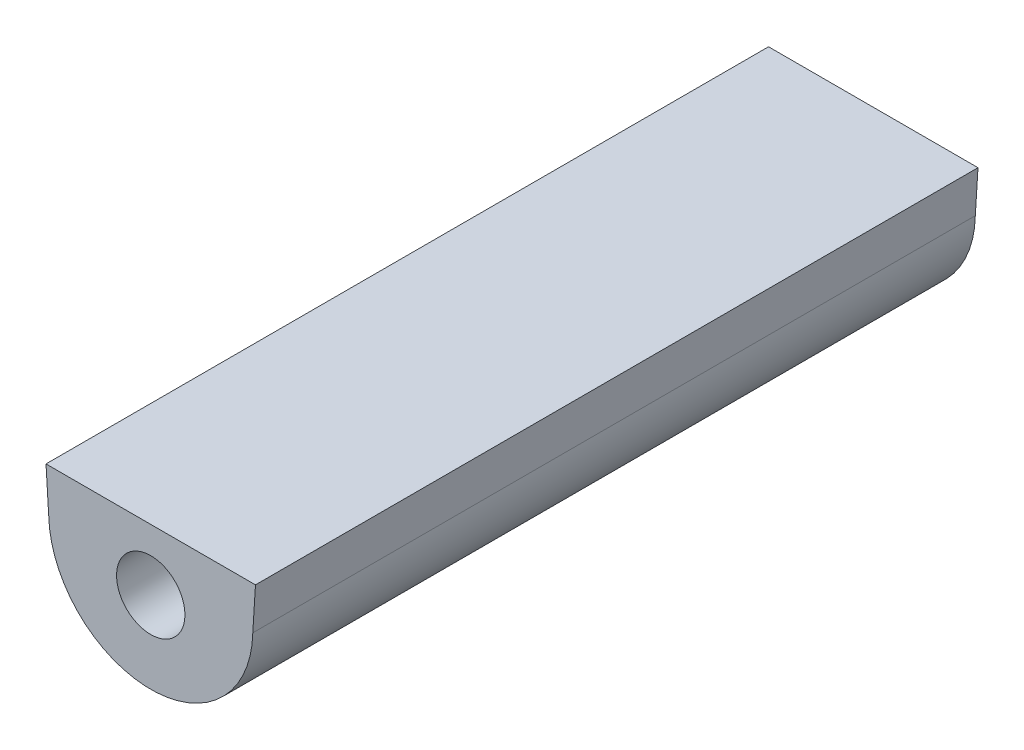
ISO-10303-21;
HEADER;
FILE_DESCRIPTION(('STEP AP214'),'2;1');
FILE_NAME('part.step','',(''),(''),'','','');
FILE_SCHEMA(('AUTOMOTIVE_DESIGN { 1 0 10303 214 1 1 1 1 }'));
ENDSEC;
DATA;
#1=APPLICATION_CONTEXT('core data for automotive mechanical design processes');
#2=APPLICATION_PROTOCOL_DEFINITION('international standard','automotive_design',2000,#1);
#3=PRODUCT_CONTEXT('',#1,'mechanical');
#4=PRODUCT('Part','Part','',(#3));
#5=PRODUCT_RELATED_PRODUCT_CATEGORY('part','',(#4));
#6=PRODUCT_DEFINITION_FORMATION('','',#4);
#7=PRODUCT_DEFINITION_CONTEXT('part definition',#1,'design');
#8=PRODUCT_DEFINITION('design','',#6,#7);
#9=PRODUCT_DEFINITION_SHAPE('','',#8);
#10=(LENGTH_UNIT() NAMED_UNIT(*) SI_UNIT(.MILLI.,.METRE.));
#11=(NAMED_UNIT(*) PLANE_ANGLE_UNIT() SI_UNIT($,.RADIAN.));
#12=(NAMED_UNIT(*) SI_UNIT($,.STERADIAN.) SOLID_ANGLE_UNIT());
#13=UNCERTAINTY_MEASURE_WITH_UNIT(LENGTH_MEASURE(1.E-05),#10,'distance_accuracy_value','');
#14=(GEOMETRIC_REPRESENTATION_CONTEXT(3) GLOBAL_UNCERTAINTY_ASSIGNED_CONTEXT((#13)) GLOBAL_UNIT_ASSIGNED_CONTEXT((#10,
#11,#12)) REPRESENTATION_CONTEXT('',''));
#15=CARTESIAN_POINT('',(0.,0.,0.));
#16=DIRECTION('',(0.,0.,1.));
#17=DIRECTION('',(1.,0.,0.));
#18=AXIS2_PLACEMENT_3D('',#15,#16,#17);
#19=CARTESIAN_POINT('',(0.312551774498435,-21.5437842902182,44.958));
#20=DIRECTION('',(0.,0.,1.));
#21=DIRECTION('',(1.,0.,0.));
#22=AXIS2_PLACEMENT_3D('',#19,#20,#21);
#23=PLANE('',#22);
#24=DIRECTION('',(1.,0.,0.));
#25=VECTOR('',#24,1.);
#26=CARTESIAN_POINT('',(-27.7506064541846,-19.0051466481699,44.958));
#27=LINE('',#26,#25);
#28=CARTESIAN_POINT('',(-6.20433457291966,-19.0051466481699,44.958));
#29=VERTEX_POINT('',#28);
#30=CARTESIAN_POINT('',(6.82943812191652,-19.0051466481699,44.958));
#31=VERTEX_POINT('',#30);
#32=EDGE_CURVE('E126',#29,#31,#27,.T.);
#33=ORIENTED_EDGE('',*,*,#32,.F.);
#34=DIRECTION('',(0.0623782861551805,-0.998052578482889,0.));
#35=VECTOR('',#34,1.);
#36=CARTESIAN_POINT('',(-9.15610687723631,28.2232102208965,44.958));
#37=LINE('',#36,#35);
#38=CARTESIAN_POINT('',(-6.03744822550156,-21.6753282068594,44.958));
#39=VERTEX_POINT('',#38);
#40=EDGE_CURVE('E63',#29,#39,#37,.T.);
#41=ORIENTED_EDGE('',*,*,#40,.T.);
#42=CARTESIAN_POINT('',(0.312551774498435,-21.5437842902182,44.958));
#43=DIRECTION('',(0.,0.,1.));
#44=DIRECTION('',(1.,0.,0.));
#45=AXIS2_PLACEMENT_3D('',#42,#43,#44);
#46=CIRCLE('',#45,6.35136235795166);
#47=CARTESIAN_POINT('',(6.66255177449844,-21.6753282068593,44.958));
#48=VERTEX_POINT('',#47);
#49=EDGE_CURVE('E84',#39,#48,#46,.T.);
#50=ORIENTED_EDGE('',*,*,#49,.T.);
#51=DIRECTION('',(0.0623782861551806,0.998052578482888,0.));
#52=VECTOR('',#51,1.);
#53=CARTESIAN_POINT('',(6.66255177449844,-21.6753282068593,44.958));
#54=LINE('',#53,#52);
#55=EDGE_CURVE('E113',#48,#31,#54,.T.);
#56=ORIENTED_EDGE('',*,*,#55,.T.);
#57=EDGE_LOOP('',(#33,#41,#50,#56));
#58=FACE_BOUND('',#57,.T.);
#59=CARTESIAN_POINT('',(0.312551774498428,-22.8151466481699,44.958));
#60=DIRECTION('',(0.,0.,1.));
#61=DIRECTION('',(1.,0.,0.));
#62=AXIS2_PLACEMENT_3D('',#59,#60,#61);
#63=CIRCLE('',#62,2.127);
#64=CARTESIAN_POINT('',(2.43955177449843,-22.8151466481699,44.958));
#65=VERTEX_POINT('',#64);
#66=EDGE_CURVE('E98',#65,#65,#63,.T.);
#67=ORIENTED_EDGE('',*,*,#66,.F.);
#68=EDGE_LOOP('',(#67));
#69=FACE_BOUND('',#68,.T.);
#70=ADVANCED_FACE('F39',(#58,#69),#23,.T.);
#71=CARTESIAN_POINT('',(0.312551774498435,-21.5437842902182,0.));
#72=DIRECTION('',(0.,0.,1.));
#73=DIRECTION('',(1.,0.,0.));
#74=AXIS2_PLACEMENT_3D('',#71,#72,#73);
#75=PLANE('',#74);
#76=DIRECTION('',(0.0623782861551805,-0.998052578482889,0.));
#77=VECTOR('',#76,1.);
#78=CARTESIAN_POINT('',(-9.15610687723631,28.2232102208965,0.));
#79=LINE('',#78,#77);
#80=CARTESIAN_POINT('',(-6.20433457291966,-19.0051466481699,0.));
#81=VERTEX_POINT('',#80);
#82=CARTESIAN_POINT('',(-6.03744822550156,-21.6753282068594,0.));
#83=VERTEX_POINT('',#82);
#84=EDGE_CURVE('E76',#81,#83,#79,.T.);
#85=ORIENTED_EDGE('',*,*,#84,.F.);
#86=DIRECTION('',(1.,0.,0.));
#87=VECTOR('',#86,1.);
#88=CARTESIAN_POINT('',(-27.7506064541846,-19.0051466481699,0.));
#89=LINE('',#88,#87);
#90=CARTESIAN_POINT('',(6.82943812191652,-19.0051466481699,0.));
#91=VERTEX_POINT('',#90);
#92=EDGE_CURVE('E55',#81,#91,#89,.T.);
#93=ORIENTED_EDGE('',*,*,#92,.T.);
#94=DIRECTION('',(0.0623782861551806,0.998052578482888,0.));
#95=VECTOR('',#94,1.);
#96=CARTESIAN_POINT('',(6.66255177449844,-21.6753282068593,0.));
#97=LINE('',#96,#95);
#98=CARTESIAN_POINT('',(6.66255177449844,-21.6753282068593,0.));
#99=VERTEX_POINT('',#98);
#100=EDGE_CURVE('E85',#99,#91,#97,.T.);
#101=ORIENTED_EDGE('',*,*,#100,.F.);
#102=CARTESIAN_POINT('',(0.312551774498435,-21.5437842902182,0.));
#103=DIRECTION('',(0.,0.,1.));
#104=DIRECTION('',(1.,0.,0.));
#105=AXIS2_PLACEMENT_3D('',#102,#103,#104);
#106=CIRCLE('',#105,6.35136235795166);
#107=EDGE_CURVE('E90',#83,#99,#106,.T.);
#108=ORIENTED_EDGE('',*,*,#107,.F.);
#109=EDGE_LOOP('',(#85,#93,#101,#108));
#110=FACE_BOUND('',#109,.T.);
#111=CARTESIAN_POINT('',(0.312551774498428,-22.8151466481699,0.));
#112=DIRECTION('',(0.,0.,1.));
#113=DIRECTION('',(1.,0.,0.));
#114=AXIS2_PLACEMENT_3D('',#111,#112,#113);
#115=CIRCLE('',#114,2.127);
#116=CARTESIAN_POINT('',(2.43955177449843,-22.8151466481699,0.));
#117=VERTEX_POINT('',#116);
#118=EDGE_CURVE('E104',#117,#117,#115,.T.);
#119=ORIENTED_EDGE('',*,*,#118,.T.);
#120=EDGE_LOOP('',(#119));
#121=FACE_BOUND('',#120,.T.);
#122=ADVANCED_FACE('F93',(#110,#121),#75,.F.);
#123=CARTESIAN_POINT('',(0.312551774498435,-21.5437842902182,44.958));
#124=DIRECTION('',(0.,0.,-1.));
#125=DIRECTION('',(-1.,0.,0.));
#126=AXIS2_PLACEMENT_3D('',#123,#124,#125);
#127=CYLINDRICAL_SURFACE('',#126,6.35136235795166);
#128=ORIENTED_EDGE('',*,*,#107,.T.);
#129=DIRECTION('',(0.,0.,-1.));
#130=VECTOR('',#129,1.);
#131=CARTESIAN_POINT('',(6.66255177449844,-21.6753282068593,44.958));
#132=LINE('',#131,#130);
#133=EDGE_CURVE('E48',#48,#99,#132,.T.);
#134=ORIENTED_EDGE('',*,*,#133,.F.);
#135=ORIENTED_EDGE('',*,*,#49,.F.);
#136=DIRECTION('',(0.,0.,-1.));
#137=VECTOR('',#136,1.);
#138=CARTESIAN_POINT('',(-6.03744822550156,-21.6753282068594,44.958));
#139=LINE('',#138,#137);
#140=EDGE_CURVE('E79',#39,#83,#139,.T.);
#141=ORIENTED_EDGE('',*,*,#140,.T.);
#142=EDGE_LOOP('',(#128,#134,#135,#141));
#143=FACE_BOUND('',#142,.T.);
#144=ADVANCED_FACE('F41',(#143),#127,.T.);
#145=CARTESIAN_POINT('',(6.66255177449844,-21.6753282068593,44.958));
#146=DIRECTION('',(-0.998052578482889,0.0623782861551806,0.));
#147=DIRECTION('',(-0.0623782861551807,-0.998052578482889,0.));
#148=AXIS2_PLACEMENT_3D('',#145,#146,#147);
#149=PLANE('',#148);
#150=ORIENTED_EDGE('',*,*,#100,.T.);
#151=DIRECTION('',(0.,0.,1.));
#152=VECTOR('',#151,1.);
#153=CARTESIAN_POINT('',(6.82943812191652,-19.0051466481699,44.958));
#154=LINE('',#153,#152);
#155=EDGE_CURVE('E115',#91,#31,#154,.T.);
#156=ORIENTED_EDGE('',*,*,#155,.T.);
#157=ORIENTED_EDGE('',*,*,#55,.F.);
#158=ORIENTED_EDGE('',*,*,#133,.T.);
#159=EDGE_LOOP('',(#150,#156,#157,#158));
#160=FACE_BOUND('',#159,.T.);
#161=ADVANCED_FACE('F110',(#160),#149,.F.);
#162=CARTESIAN_POINT('',(-9.15610687723631,28.2232102208965,44.958));
#163=DIRECTION('',(0.998052578482889,0.0623782861551806,0.));
#164=DIRECTION('',(-0.0623782861551806,0.998052578482889,0.));
#165=AXIS2_PLACEMENT_3D('',#162,#163,#164);
#166=PLANE('',#165);
#167=ORIENTED_EDGE('',*,*,#40,.F.);
#168=DIRECTION('',(0.,0.,-1.));
#169=VECTOR('',#168,1.);
#170=CARTESIAN_POINT('',(-6.20433457291966,-19.0051466481699,44.958));
#171=LINE('',#170,#169);
#172=EDGE_CURVE('E11',#29,#81,#171,.T.);
#173=ORIENTED_EDGE('',*,*,#172,.T.);
#174=ORIENTED_EDGE('',*,*,#84,.T.);
#175=ORIENTED_EDGE('',*,*,#140,.F.);
#176=EDGE_LOOP('',(#167,#173,#174,#175));
#177=FACE_BOUND('',#176,.T.);
#178=ADVANCED_FACE('F78',(#177),#166,.F.);
#179=CARTESIAN_POINT('',(0.312551774498428,-22.8151466481699,44.958));
#180=DIRECTION('',(0.,0.,-1.));
#181=DIRECTION('',(-1.,0.,0.));
#182=AXIS2_PLACEMENT_3D('',#179,#180,#181);
#183=CYLINDRICAL_SURFACE('',#182,2.127);
#184=ORIENTED_EDGE('',*,*,#66,.T.);
#185=EDGE_LOOP('',(#184));
#186=FACE_BOUND('',#185,.T.);
#187=ORIENTED_EDGE('',*,*,#118,.F.);
#188=EDGE_LOOP('',(#187));
#189=FACE_BOUND('',#188,.T.);
#190=ADVANCED_FACE('F137',(#186,#189),#183,.F.);
#191=CARTESIAN_POINT('',(-27.7506064541846,-19.0051466481699,0.));
#192=DIRECTION('',(0.,-1.,0.));
#193=DIRECTION('',(0.,0.,-1.));
#194=AXIS2_PLACEMENT_3D('',#191,#192,#193);
#195=PLANE('',#194);
#196=ORIENTED_EDGE('',*,*,#92,.F.);
#197=ORIENTED_EDGE('',*,*,#172,.F.);
#198=ORIENTED_EDGE('',*,*,#32,.T.);
#199=ORIENTED_EDGE('',*,*,#155,.F.);
#200=EDGE_LOOP('',(#196,#197,#198,#199));
#201=FACE_BOUND('',#200,.T.);
#202=ADVANCED_FACE('F134',(#201),#195,.F.);
#203=CLOSED_SHELL('',(#70,#122,#144,#161,#178,#190,#202));
#204=MANIFOLD_SOLID_BREP('B2',#203);
#205=ADVANCED_BREP_SHAPE_REPRESENTATION('',(#18,#204),#14);
#206=SHAPE_DEFINITION_REPRESENTATION(#9,#205);
ENDSEC;
END-ISO-10303-21;
